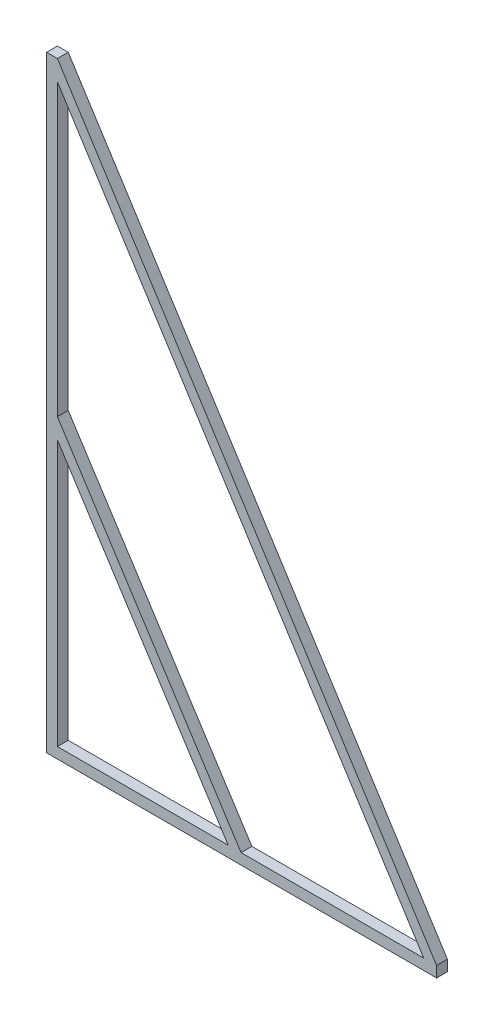
ISO-10303-21;
HEADER;
FILE_DESCRIPTION(('STEP AP214'),'2;1');
FILE_NAME('part.step','',(''),(''),'','','');
FILE_SCHEMA(('AUTOMOTIVE_DESIGN { 1 0 10303 214 1 1 1 1 }'));
ENDSEC;
DATA;
#1=APPLICATION_CONTEXT('core data for automotive mechanical design processes');
#2=APPLICATION_PROTOCOL_DEFINITION('international standard','automotive_design',2000,#1);
#3=PRODUCT_CONTEXT('',#1,'mechanical');
#4=PRODUCT('Part','Part','',(#3));
#5=PRODUCT_RELATED_PRODUCT_CATEGORY('part','',(#4));
#6=PRODUCT_DEFINITION_FORMATION('','',#4);
#7=PRODUCT_DEFINITION_CONTEXT('part definition',#1,'design');
#8=PRODUCT_DEFINITION('design','',#6,#7);
#9=PRODUCT_DEFINITION_SHAPE('','',#8);
#10=(LENGTH_UNIT() NAMED_UNIT(*) SI_UNIT(.MILLI.,.METRE.));
#11=(NAMED_UNIT(*) PLANE_ANGLE_UNIT() SI_UNIT($,.RADIAN.));
#12=(NAMED_UNIT(*) SI_UNIT($,.STERADIAN.) SOLID_ANGLE_UNIT());
#13=UNCERTAINTY_MEASURE_WITH_UNIT(LENGTH_MEASURE(1.E-05),#10,'distance_accuracy_value','');
#14=(GEOMETRIC_REPRESENTATION_CONTEXT(3) GLOBAL_UNCERTAINTY_ASSIGNED_CONTEXT((#13)) GLOBAL_UNIT_ASSIGNED_CONTEXT((#10,
#11,#12)) REPRESENTATION_CONTEXT('',''));
#15=CARTESIAN_POINT('',(0.,0.,0.));
#16=DIRECTION('',(0.,0.,1.));
#17=DIRECTION('',(1.,0.,0.));
#18=AXIS2_PLACEMENT_3D('',#15,#16,#17);
#19=CARTESIAN_POINT('',(0.,0.,5.));
#20=DIRECTION('',(0.,0.,1.));
#21=DIRECTION('',(1.,0.,0.));
#22=AXIS2_PLACEMENT_3D('',#19,#20,#21);
#23=PLANE('',#22);
#24=DIRECTION('',(-0.540757591313499,0.841178475376553,0.));
#25=VECTOR('',#24,1.);
#26=CARTESIAN_POINT('',(4.99999999999995,127.599078617474,5.));
#27=LINE('',#26,#25);
#28=CARTESIAN_POINT('',(83.8136933969477,5.,5.));
#29=VERTEX_POINT('',#28);
#30=CARTESIAN_POINT('',(4.99999999999995,127.599078617474,5.));
#31=VERTEX_POINT('',#30);
#32=EDGE_CURVE('E160',#29,#31,#27,.T.);
#33=ORIENTED_EDGE('',*,*,#32,.F.);
#34=DIRECTION('',(1.,0.,0.));
#35=VECTOR('',#34,1.);
#36=CARTESIAN_POINT('',(4.99999999999995,5.,5.));
#37=LINE('',#36,#35);
#38=CARTESIAN_POINT('',(4.99999999999995,5.,5.));
#39=VERTEX_POINT('',#38);
#40=EDGE_CURVE('E158',#39,#29,#37,.T.);
#41=ORIENTED_EDGE('',*,*,#40,.F.);
#42=DIRECTION('',(0.,-1.,0.));
#43=VECTOR('',#42,1.);
#44=CARTESIAN_POINT('',(4.99999999999995,5.,5.));
#45=LINE('',#44,#43);
#46=EDGE_CURVE('E164',#31,#39,#45,.T.);
#47=ORIENTED_EDGE('',*,*,#46,.F.);
#48=EDGE_LOOP('',(#33,#41,#47));
#49=FACE_BOUND('',#48,.T.);
#50=DIRECTION('',(-0.536875492193159,0.843661487732107,0.));
#51=VECTOR('',#50,1.);
#52=CARTESIAN_POINT('',(4.99999999999995,280.,5.));
#53=LINE('',#52,#51);
#54=CARTESIAN_POINT('',(180.,5.,5.));
#55=VERTEX_POINT('',#54);
#56=CARTESIAN_POINT('',(4.99999999999995,280.,5.));
#57=VERTEX_POINT('',#56);
#58=EDGE_CURVE('E182',#55,#57,#53,.T.);
#59=ORIENTED_EDGE('',*,*,#58,.T.);
#60=DIRECTION('',(-1.,0.,0.));
#61=VECTOR('',#60,1.);
#62=CARTESIAN_POINT('',(0.,280.,5.));
#63=LINE('',#62,#61);
#64=CARTESIAN_POINT('',(0.,280.,5.));
#65=VERTEX_POINT('',#64);
#66=EDGE_CURVE('E185',#57,#65,#63,.T.);
#67=ORIENTED_EDGE('',*,*,#66,.T.);
#68=DIRECTION('',(0.,-1.,0.));
#69=VECTOR('',#68,1.);
#70=CARTESIAN_POINT('',(0.,0.,5.));
#71=LINE('',#70,#69);
#72=CARTESIAN_POINT('',(0.,0.,5.));
#73=VERTEX_POINT('',#72);
#74=EDGE_CURVE('E188',#65,#73,#71,.T.);
#75=ORIENTED_EDGE('',*,*,#74,.T.);
#76=DIRECTION('',(1.,0.,0.));
#77=VECTOR('',#76,1.);
#78=CARTESIAN_POINT('',(0.,0.,5.));
#79=LINE('',#78,#77);
#80=CARTESIAN_POINT('',(180.,0.,5.));
#81=VERTEX_POINT('',#80);
#82=EDGE_CURVE('E190',#73,#81,#79,.T.);
#83=ORIENTED_EDGE('',*,*,#82,.T.);
#84=DIRECTION('',(0.,1.,0.));
#85=VECTOR('',#84,1.);
#86=CARTESIAN_POINT('',(180.,0.,5.));
#87=LINE('',#86,#85);
#88=EDGE_CURVE('E192',#81,#55,#87,.T.);
#89=ORIENTED_EDGE('',*,*,#88,.T.);
#90=EDGE_LOOP('',(#59,#67,#75,#83,#89));
#91=FACE_BOUND('',#90,.T.);
#92=DIRECTION('',(0.540757591313499,-0.841178475376554,0.));
#93=VECTOR('',#92,1.);
#94=CARTESIAN_POINT('',(4.99999999999995,136.84536582697,5.));
#95=LINE('',#94,#93);
#96=CARTESIAN_POINT('',(4.99999999999995,136.84536582697,5.));
#97=VERTEX_POINT('',#96);
#98=CARTESIAN_POINT('',(89.757735174481,5.,5.));
#99=VERTEX_POINT('',#98);
#100=EDGE_CURVE('E130',#97,#99,#95,.T.);
#101=ORIENTED_EDGE('',*,*,#100,.F.);
#102=DIRECTION('',(0.,-1.,0.));
#103=VECTOR('',#102,1.);
#104=CARTESIAN_POINT('',(4.99999999999995,136.84536582697,5.));
#105=LINE('',#104,#103);
#106=CARTESIAN_POINT('',(4.99999999999995,270.686853706853,5.));
#107=VERTEX_POINT('',#106);
#108=EDGE_CURVE('E122',#107,#97,#105,.T.);
#109=ORIENTED_EDGE('',*,*,#108,.F.);
#110=DIRECTION('',(-0.536875492193159,0.843661487732107,0.));
#111=VECTOR('',#110,1.);
#112=CARTESIAN_POINT('',(4.99999999999995,270.686853706853,5.));
#113=LINE('',#112,#111);
#114=CARTESIAN_POINT('',(174.073452358907,5.00000000000006,5.));
#115=VERTEX_POINT('',#114);
#116=EDGE_CURVE('E144',#115,#107,#113,.T.);
#117=ORIENTED_EDGE('',*,*,#116,.F.);
#118=DIRECTION('',(1.,0.,0.));
#119=VECTOR('',#118,1.);
#120=CARTESIAN_POINT('',(89.757735174481,5.,5.));
#121=LINE('',#120,#119);
#122=EDGE_CURVE('E142',#99,#115,#121,.T.);
#123=ORIENTED_EDGE('',*,*,#122,.F.);
#124=EDGE_LOOP('',(#101,#109,#117,#123));
#125=FACE_BOUND('',#124,.T.);
#126=ADVANCED_FACE('F33',(#49,#91,#125),#23,.T.);
#127=CARTESIAN_POINT('',(0.,0.,0.));
#128=DIRECTION('',(0.,0.,1.));
#129=DIRECTION('',(1.,0.,0.));
#130=AXIS2_PLACEMENT_3D('',#127,#128,#129);
#131=PLANE('',#130);
#132=DIRECTION('',(1.,0.,0.));
#133=VECTOR('',#132,1.);
#134=CARTESIAN_POINT('',(4.99999999999995,5.,0.));
#135=LINE('',#134,#133);
#136=CARTESIAN_POINT('',(4.99999999999995,5.,0.));
#137=VERTEX_POINT('',#136);
#138=CARTESIAN_POINT('',(83.8136933969477,5.,0.));
#139=VERTEX_POINT('',#138);
#140=EDGE_CURVE('E138',#137,#139,#135,.T.);
#141=ORIENTED_EDGE('',*,*,#140,.T.);
#142=DIRECTION('',(-0.540757591313499,0.841178475376553,0.));
#143=VECTOR('',#142,1.);
#144=CARTESIAN_POINT('',(4.99999999999995,127.599078617474,0.));
#145=LINE('',#144,#143);
#146=CARTESIAN_POINT('',(4.99999999999995,127.599078617474,0.));
#147=VERTEX_POINT('',#146);
#148=EDGE_CURVE('E169',#139,#147,#145,.T.);
#149=ORIENTED_EDGE('',*,*,#148,.T.);
#150=DIRECTION('',(0.,-1.,0.));
#151=VECTOR('',#150,1.);
#152=CARTESIAN_POINT('',(4.99999999999995,5.,0.));
#153=LINE('',#152,#151);
#154=EDGE_CURVE('E161',#147,#137,#153,.T.);
#155=ORIENTED_EDGE('',*,*,#154,.T.);
#156=EDGE_LOOP('',(#141,#149,#155));
#157=FACE_BOUND('',#156,.T.);
#158=DIRECTION('',(-0.536875492193159,0.843661487732107,0.));
#159=VECTOR('',#158,1.);
#160=CARTESIAN_POINT('',(4.99999999999995,280.,0.));
#161=LINE('',#160,#159);
#162=CARTESIAN_POINT('',(180.,5.,0.));
#163=VERTEX_POINT('',#162);
#164=CARTESIAN_POINT('',(4.99999999999995,280.,0.));
#165=VERTEX_POINT('',#164);
#166=EDGE_CURVE('E181',#163,#165,#161,.T.);
#167=ORIENTED_EDGE('',*,*,#166,.F.);
#168=DIRECTION('',(0.,1.,0.));
#169=VECTOR('',#168,1.);
#170=CARTESIAN_POINT('',(180.,0.,0.));
#171=LINE('',#170,#169);
#172=CARTESIAN_POINT('',(180.,0.,0.));
#173=VERTEX_POINT('',#172);
#174=EDGE_CURVE('E186',#173,#163,#171,.T.);
#175=ORIENTED_EDGE('',*,*,#174,.F.);
#176=DIRECTION('',(1.,0.,0.));
#177=VECTOR('',#176,1.);
#178=CARTESIAN_POINT('',(0.,0.,0.));
#179=LINE('',#178,#177);
#180=CARTESIAN_POINT('',(0.,0.,0.));
#181=VERTEX_POINT('',#180);
#182=EDGE_CURVE('E201',#181,#173,#179,.T.);
#183=ORIENTED_EDGE('',*,*,#182,.F.);
#184=DIRECTION('',(0.,-1.,0.));
#185=VECTOR('',#184,1.);
#186=CARTESIAN_POINT('',(0.,0.,0.));
#187=LINE('',#186,#185);
#188=CARTESIAN_POINT('',(0.,280.,0.));
#189=VERTEX_POINT('',#188);
#190=EDGE_CURVE('E199',#189,#181,#187,.T.);
#191=ORIENTED_EDGE('',*,*,#190,.F.);
#192=DIRECTION('',(-1.,0.,0.));
#193=VECTOR('',#192,1.);
#194=CARTESIAN_POINT('',(0.,280.,0.));
#195=LINE('',#194,#193);
#196=EDGE_CURVE('E197',#165,#189,#195,.T.);
#197=ORIENTED_EDGE('',*,*,#196,.F.);
#198=EDGE_LOOP('',(#167,#175,#183,#191,#197));
#199=FACE_BOUND('',#198,.T.);
#200=DIRECTION('',(0.,-1.,0.));
#201=VECTOR('',#200,1.);
#202=CARTESIAN_POINT('',(4.99999999999995,136.84536582697,0.));
#203=LINE('',#202,#201);
#204=CARTESIAN_POINT('',(4.99999999999999,270.686853706853,0.));
#205=VERTEX_POINT('',#204);
#206=CARTESIAN_POINT('',(4.99999999999995,136.84536582697,0.));
#207=VERTEX_POINT('',#206);
#208=EDGE_CURVE('E56',#205,#207,#203,.T.);
#209=ORIENTED_EDGE('',*,*,#208,.T.);
#210=DIRECTION('',(0.540757591313499,-0.841178475376554,0.));
#211=VECTOR('',#210,1.);
#212=CARTESIAN_POINT('',(4.99999999999995,136.84536582697,0.));
#213=LINE('',#212,#211);
#214=CARTESIAN_POINT('',(89.757735174481,5.,0.));
#215=VERTEX_POINT('',#214);
#216=EDGE_CURVE('E137',#207,#215,#213,.T.);
#217=ORIENTED_EDGE('',*,*,#216,.T.);
#218=DIRECTION('',(1.,0.,0.));
#219=VECTOR('',#218,1.);
#220=CARTESIAN_POINT('',(89.757735174481,5.,0.));
#221=LINE('',#220,#219);
#222=CARTESIAN_POINT('',(174.073452358907,5.00000000000006,0.));
#223=VERTEX_POINT('',#222);
#224=EDGE_CURVE('E150',#215,#223,#221,.T.);
#225=ORIENTED_EDGE('',*,*,#224,.T.);
#226=DIRECTION('',(-0.536875492193159,0.843661487732107,0.));
#227=VECTOR('',#226,1.);
#228=CARTESIAN_POINT('',(4.99999999999995,270.686853706853,0.));
#229=LINE('',#228,#227);
#230=EDGE_CURVE('E131',#223,#205,#229,.T.);
#231=ORIENTED_EDGE('',*,*,#230,.T.);
#232=EDGE_LOOP('',(#209,#217,#225,#231));
#233=FACE_BOUND('',#232,.T.);
#234=ADVANCED_FACE('F222',(#157,#199,#233),#131,.F.);
#235=CARTESIAN_POINT('',(4.99999999999995,280.,5.));
#236=DIRECTION('',(-0.843661487732107,-0.536875492193159,0.));
#237=DIRECTION('',(0.536875492193159,-0.843661487732108,0.));
#238=AXIS2_PLACEMENT_3D('',#235,#236,#237);
#239=PLANE('',#238);
#240=ORIENTED_EDGE('',*,*,#166,.T.);
#241=DIRECTION('',(0.,0.,-1.));
#242=VECTOR('',#241,1.);
#243=CARTESIAN_POINT('',(4.99999999999995,280.,5.));
#244=LINE('',#243,#242);
#245=EDGE_CURVE('E11',#57,#165,#244,.T.);
#246=ORIENTED_EDGE('',*,*,#245,.F.);
#247=ORIENTED_EDGE('',*,*,#58,.F.);
#248=DIRECTION('',(0.,0.,-1.));
#249=VECTOR('',#248,1.);
#250=CARTESIAN_POINT('',(180.,5.,5.));
#251=LINE('',#250,#249);
#252=EDGE_CURVE('E194',#55,#163,#251,.T.);
#253=ORIENTED_EDGE('',*,*,#252,.T.);
#254=EDGE_LOOP('',(#240,#246,#247,#253));
#255=FACE_BOUND('',#254,.T.);
#256=ADVANCED_FACE('F35',(#255),#239,.F.);
#257=CARTESIAN_POINT('',(0.,280.,5.));
#258=DIRECTION('',(0.,-1.,0.));
#259=DIRECTION('',(0.,0.,-1.));
#260=AXIS2_PLACEMENT_3D('',#257,#258,#259);
#261=PLANE('',#260);
#262=ORIENTED_EDGE('',*,*,#196,.T.);
#263=DIRECTION('',(0.,0.,-1.));
#264=VECTOR('',#263,1.);
#265=CARTESIAN_POINT('',(0.,280.,5.));
#266=LINE('',#265,#264);
#267=EDGE_CURVE('E41',#65,#189,#266,.T.);
#268=ORIENTED_EDGE('',*,*,#267,.F.);
#269=ORIENTED_EDGE('',*,*,#66,.F.);
#270=ORIENTED_EDGE('',*,*,#245,.T.);
#271=EDGE_LOOP('',(#262,#268,#269,#270));
#272=FACE_BOUND('',#271,.T.);
#273=ADVANCED_FACE('F236',(#272),#261,.F.);
#274=CARTESIAN_POINT('',(0.,0.,5.));
#275=DIRECTION('',(1.,0.,0.));
#276=DIRECTION('',(0.,1.,0.));
#277=AXIS2_PLACEMENT_3D('',#274,#275,#276);
#278=PLANE('',#277);
#279=ORIENTED_EDGE('',*,*,#190,.T.);
#280=DIRECTION('',(0.,0.,-1.));
#281=VECTOR('',#280,1.);
#282=CARTESIAN_POINT('',(0.,0.,5.));
#283=LINE('',#282,#281);
#284=EDGE_CURVE('E209',#73,#181,#283,.T.);
#285=ORIENTED_EDGE('',*,*,#284,.F.);
#286=ORIENTED_EDGE('',*,*,#74,.F.);
#287=ORIENTED_EDGE('',*,*,#267,.T.);
#288=EDGE_LOOP('',(#279,#285,#286,#287));
#289=FACE_BOUND('',#288,.T.);
#290=ADVANCED_FACE('F216',(#289),#278,.F.);
#291=CARTESIAN_POINT('',(0.,0.,5.));
#292=DIRECTION('',(0.,1.,0.));
#293=DIRECTION('',(-1.,0.,0.));
#294=AXIS2_PLACEMENT_3D('',#291,#292,#293);
#295=PLANE('',#294);
#296=ORIENTED_EDGE('',*,*,#182,.T.);
#297=DIRECTION('',(0.,0.,-1.));
#298=VECTOR('',#297,1.);
#299=CARTESIAN_POINT('',(180.,0.,5.));
#300=LINE('',#299,#298);
#301=EDGE_CURVE('E206',#81,#173,#300,.T.);
#302=ORIENTED_EDGE('',*,*,#301,.F.);
#303=ORIENTED_EDGE('',*,*,#82,.F.);
#304=ORIENTED_EDGE('',*,*,#284,.T.);
#305=EDGE_LOOP('',(#296,#302,#303,#304));
#306=FACE_BOUND('',#305,.T.);
#307=ADVANCED_FACE('F227',(#306),#295,.F.);
#308=CARTESIAN_POINT('',(180.,0.,5.));
#309=DIRECTION('',(-1.,0.,0.));
#310=DIRECTION('',(0.,0.,1.));
#311=AXIS2_PLACEMENT_3D('',#308,#309,#310);
#312=PLANE('',#311);
#313=ORIENTED_EDGE('',*,*,#174,.T.);
#314=ORIENTED_EDGE('',*,*,#252,.F.);
#315=ORIENTED_EDGE('',*,*,#88,.F.);
#316=ORIENTED_EDGE('',*,*,#301,.T.);
#317=EDGE_LOOP('',(#313,#314,#315,#316));
#318=FACE_BOUND('',#317,.T.);
#319=ADVANCED_FACE('F231',(#318),#312,.F.);
#320=CARTESIAN_POINT('',(4.99999999999995,5.,5.));
#321=DIRECTION('',(0.,1.,0.));
#322=DIRECTION('',(-1.,0.,0.));
#323=AXIS2_PLACEMENT_3D('',#320,#321,#322);
#324=PLANE('',#323);
#325=ORIENTED_EDGE('',*,*,#140,.F.);
#326=DIRECTION('',(0.,0.,-1.));
#327=VECTOR('',#326,1.);
#328=CARTESIAN_POINT('',(4.99999999999995,5.,5.));
#329=LINE('',#328,#327);
#330=EDGE_CURVE('E166',#39,#137,#329,.T.);
#331=ORIENTED_EDGE('',*,*,#330,.F.);
#332=ORIENTED_EDGE('',*,*,#40,.T.);
#333=DIRECTION('',(0.,0.,-1.));
#334=VECTOR('',#333,1.);
#335=CARTESIAN_POINT('',(83.8136933969477,5.,5.));
#336=LINE('',#335,#334);
#337=EDGE_CURVE('E178',#29,#139,#336,.T.);
#338=ORIENTED_EDGE('',*,*,#337,.T.);
#339=EDGE_LOOP('',(#325,#331,#332,#338));
#340=FACE_BOUND('',#339,.T.);
#341=ADVANCED_FACE('F252',(#340),#324,.T.);
#342=CARTESIAN_POINT('',(4.99999999999995,127.599078617474,5.));
#343=DIRECTION('',(-0.841178475376554,-0.540757591313499,0.));
#344=DIRECTION('',(0.540757591313499,-0.841178475376554,0.));
#345=AXIS2_PLACEMENT_3D('',#342,#343,#344);
#346=PLANE('',#345);
#347=ORIENTED_EDGE('',*,*,#148,.F.);
#348=ORIENTED_EDGE('',*,*,#337,.F.);
#349=ORIENTED_EDGE('',*,*,#32,.T.);
#350=DIRECTION('',(0.,0.,-1.));
#351=VECTOR('',#350,1.);
#352=CARTESIAN_POINT('',(4.99999999999995,127.599078617474,5.));
#353=LINE('',#352,#351);
#354=EDGE_CURVE('E176',#31,#147,#353,.T.);
#355=ORIENTED_EDGE('',*,*,#354,.T.);
#356=EDGE_LOOP('',(#347,#348,#349,#355));
#357=FACE_BOUND('',#356,.T.);
#358=ADVANCED_FACE('F278',(#357),#346,.T.);
#359=CARTESIAN_POINT('',(4.99999999999995,5.,5.));
#360=DIRECTION('',(1.,0.,0.));
#361=DIRECTION('',(0.,0.,-1.));
#362=AXIS2_PLACEMENT_3D('',#359,#360,#361);
#363=PLANE('',#362);
#364=ORIENTED_EDGE('',*,*,#154,.F.);
#365=ORIENTED_EDGE('',*,*,#354,.F.);
#366=ORIENTED_EDGE('',*,*,#46,.T.);
#367=ORIENTED_EDGE('',*,*,#330,.T.);
#368=EDGE_LOOP('',(#364,#365,#366,#367));
#369=FACE_BOUND('',#368,.T.);
#370=ADVANCED_FACE('F285',(#369),#363,.T.);
#371=CARTESIAN_POINT('',(4.99999999999995,136.84536582697,5.));
#372=DIRECTION('',(1.,0.,0.));
#373=DIRECTION('',(0.,1.,0.));
#374=AXIS2_PLACEMENT_3D('',#371,#372,#373);
#375=PLANE('',#374);
#376=ORIENTED_EDGE('',*,*,#208,.F.);
#377=DIRECTION('',(0.,0.,-1.));
#378=VECTOR('',#377,1.);
#379=CARTESIAN_POINT('',(4.99999999999995,270.686853706853,5.));
#380=LINE('',#379,#378);
#381=EDGE_CURVE('E126',#107,#205,#380,.T.);
#382=ORIENTED_EDGE('',*,*,#381,.F.);
#383=ORIENTED_EDGE('',*,*,#108,.T.);
#384=DIRECTION('',(0.,0.,-1.));
#385=VECTOR('',#384,1.);
#386=CARTESIAN_POINT('',(4.99999999999995,136.84536582697,5.));
#387=LINE('',#386,#385);
#388=EDGE_CURVE('E125',#97,#207,#387,.T.);
#389=ORIENTED_EDGE('',*,*,#388,.T.);
#390=EDGE_LOOP('',(#376,#382,#383,#389));
#391=FACE_BOUND('',#390,.T.);
#392=ADVANCED_FACE('F124',(#391),#375,.T.);
#393=CARTESIAN_POINT('',(4.99999999999995,136.84536582697,5.));
#394=DIRECTION('',(0.841178475376554,0.540757591313499,0.));
#395=DIRECTION('',(-0.540757591313499,0.841178475376554,0.));
#396=AXIS2_PLACEMENT_3D('',#393,#394,#395);
#397=PLANE('',#396);
#398=ORIENTED_EDGE('',*,*,#216,.F.);
#399=ORIENTED_EDGE('',*,*,#388,.F.);
#400=ORIENTED_EDGE('',*,*,#100,.T.);
#401=DIRECTION('',(0.,0.,-1.));
#402=VECTOR('',#401,1.);
#403=CARTESIAN_POINT('',(89.757735174481,5.,5.));
#404=LINE('',#403,#402);
#405=EDGE_CURVE('E139',#99,#215,#404,.T.);
#406=ORIENTED_EDGE('',*,*,#405,.T.);
#407=EDGE_LOOP('',(#398,#399,#400,#406));
#408=FACE_BOUND('',#407,.T.);
#409=ADVANCED_FACE('F134',(#408),#397,.T.);
#410=CARTESIAN_POINT('',(89.757735174481,5.,5.));
#411=DIRECTION('',(0.,1.,0.));
#412=DIRECTION('',(-1.,0.,0.));
#413=AXIS2_PLACEMENT_3D('',#410,#411,#412);
#414=PLANE('',#413);
#415=ORIENTED_EDGE('',*,*,#224,.F.);
#416=ORIENTED_EDGE('',*,*,#405,.F.);
#417=ORIENTED_EDGE('',*,*,#122,.T.);
#418=DIRECTION('',(0.,0.,-1.));
#419=VECTOR('',#418,1.);
#420=CARTESIAN_POINT('',(174.073452358907,5.00000000000006,5.));
#421=LINE('',#420,#419);
#422=EDGE_CURVE('E48',#115,#223,#421,.T.);
#423=ORIENTED_EDGE('',*,*,#422,.T.);
#424=EDGE_LOOP('',(#415,#416,#417,#423));
#425=FACE_BOUND('',#424,.T.);
#426=ADVANCED_FACE('F305',(#425),#414,.T.);
#427=CARTESIAN_POINT('',(4.99999999999995,270.686853706853,5.));
#428=DIRECTION('',(-0.843661487732107,-0.536875492193159,0.));
#429=DIRECTION('',(0.536875492193159,-0.843661487732108,0.));
#430=AXIS2_PLACEMENT_3D('',#427,#428,#429);
#431=PLANE('',#430);
#432=ORIENTED_EDGE('',*,*,#230,.F.);
#433=ORIENTED_EDGE('',*,*,#422,.F.);
#434=ORIENTED_EDGE('',*,*,#116,.T.);
#435=ORIENTED_EDGE('',*,*,#381,.T.);
#436=EDGE_LOOP('',(#432,#433,#434,#435));
#437=FACE_BOUND('',#436,.T.);
#438=ADVANCED_FACE('F312',(#437),#431,.T.);
#439=CLOSED_SHELL('',(#126,#234,#256,#273,#290,#307,#319,#341,#358,#370,#392,#409,#426,#438));
#440=MANIFOLD_SOLID_BREP('B2',#439);
#441=ADVANCED_BREP_SHAPE_REPRESENTATION('',(#18,#440),#14);
#442=SHAPE_DEFINITION_REPRESENTATION(#9,#441);
ENDSEC;
END-ISO-10303-21;
